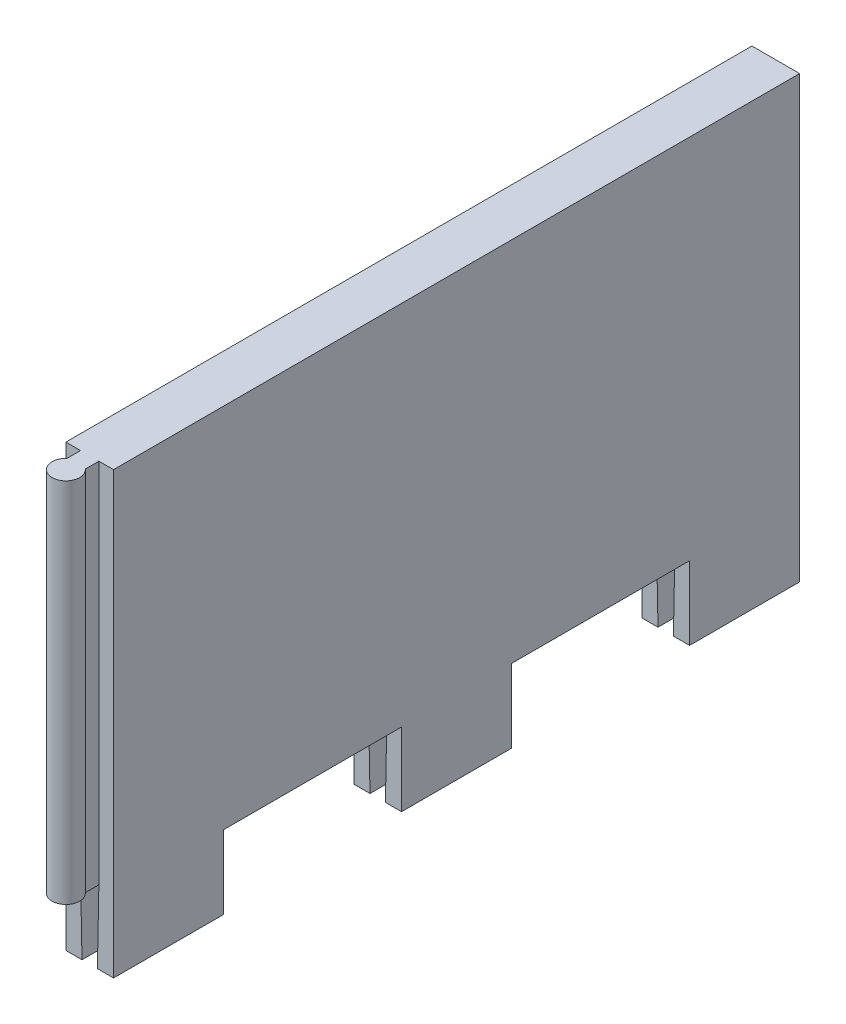
ISO-10303-21;
HEADER;
FILE_DESCRIPTION(('STEP AP214'),'2;1');
FILE_NAME('part.step','',(''),(''),'','','');
FILE_SCHEMA(('AUTOMOTIVE_DESIGN { 1 0 10303 214 1 1 1 1 }'));
ENDSEC;
DATA;
#1=APPLICATION_CONTEXT('core data for automotive mechanical design processes');
#2=APPLICATION_PROTOCOL_DEFINITION('international standard','automotive_design',2000,#1);
#3=PRODUCT_CONTEXT('',#1,'mechanical');
#4=PRODUCT('Part','Part','',(#3));
#5=PRODUCT_RELATED_PRODUCT_CATEGORY('part','',(#4));
#6=PRODUCT_DEFINITION_FORMATION('','',#4);
#7=PRODUCT_DEFINITION_CONTEXT('part definition',#1,'design');
#8=PRODUCT_DEFINITION('design','',#6,#7);
#9=PRODUCT_DEFINITION_SHAPE('','',#8);
#10=(LENGTH_UNIT() NAMED_UNIT(*) SI_UNIT(.MILLI.,.METRE.));
#11=(NAMED_UNIT(*) PLANE_ANGLE_UNIT() SI_UNIT($,.RADIAN.));
#12=(NAMED_UNIT(*) SI_UNIT($,.STERADIAN.) SOLID_ANGLE_UNIT());
#13=UNCERTAINTY_MEASURE_WITH_UNIT(LENGTH_MEASURE(1.E-05),#10,'distance_accuracy_value','');
#14=(GEOMETRIC_REPRESENTATION_CONTEXT(3) GLOBAL_UNCERTAINTY_ASSIGNED_CONTEXT((#13)) GLOBAL_UNIT_ASSIGNED_CONTEXT((#10,
#11,#12)) REPRESENTATION_CONTEXT('',''));
#15=CARTESIAN_POINT('',(0.,0.,0.));
#16=DIRECTION('',(0.,0.,1.));
#17=DIRECTION('',(1.,0.,0.));
#18=AXIS2_PLACEMENT_3D('',#15,#16,#17);
#19=CARTESIAN_POINT('',(0.,0.,0.));
#20=DIRECTION('',(0.,1.,0.));
#21=DIRECTION('',(0.,0.,1.));
#22=AXIS2_PLACEMENT_3D('',#19,#20,#21);
#23=PLANE('',#22);
#24=DIRECTION('',(0.,0.,1.));
#25=VECTOR('',#24,1.);
#26=CARTESIAN_POINT('',(-60.96,0.,0.));
#27=LINE('',#26,#25);
#28=CARTESIAN_POINT('',(-60.96,0.,-27.305));
#29=VERTEX_POINT('',#28);
#30=CARTESIAN_POINT('',(-60.96,0.,-8.255));
#31=VERTEX_POINT('',#30);
#32=EDGE_CURVE('E375',#29,#31,#27,.T.);
#33=ORIENTED_EDGE('',*,*,#32,.T.);
#34=DIRECTION('',(1.,0.,0.));
#35=VECTOR('',#34,1.);
#36=CARTESIAN_POINT('',(0.,0.,-8.25500000000002));
#37=LINE('',#36,#35);
#38=CARTESIAN_POINT('',(-63.7539999999999,0.,-8.25500000000002));
#39=VERTEX_POINT('',#38);
#40=EDGE_CURVE('E243',#39,#31,#37,.T.);
#41=ORIENTED_EDGE('',*,*,#40,.F.);
#42=DIRECTION('',(0.,0.,-1.));
#43=VECTOR('',#42,1.);
#44=CARTESIAN_POINT('',(-63.754,0.,4.83339596742091));
#45=LINE('',#44,#43);
#46=CARTESIAN_POINT('',(-63.7539999999998,0.,-27.305));
#47=VERTEX_POINT('',#46);
#48=EDGE_CURVE('E365',#39,#47,#45,.T.);
#49=ORIENTED_EDGE('',*,*,#48,.T.);
#50=DIRECTION('',(-1.,0.,0.));
#51=VECTOR('',#50,1.);
#52=CARTESIAN_POINT('',(0.,0.,-27.3050000000001));
#53=LINE('',#52,#51);
#54=EDGE_CURVE('E306',#29,#47,#53,.T.);
#55=ORIENTED_EDGE('',*,*,#54,.F.);
#56=EDGE_LOOP('',(#33,#41,#49,#55));
#57=FACE_BOUND('',#56,.T.);
#58=ADVANCED_FACE('F40',(#57),#23,.F.);
#59=CARTESIAN_POINT('',(0.,76.2,0.));
#60=DIRECTION('',(0.,1.,0.));
#61=DIRECTION('',(0.,0.,1.));
#62=AXIS2_PLACEMENT_3D('',#59,#60,#61);
#63=PLANE('',#62);
#64=DIRECTION('',(0.,0.,1.));
#65=VECTOR('',#64,1.);
#66=CARTESIAN_POINT('',(-63.5,76.2,0.));
#67=LINE('',#66,#65);
#68=CARTESIAN_POINT('',(-63.5,76.2,-8.255));
#69=VERTEX_POINT('',#68);
#70=CARTESIAN_POINT('',(-63.5,76.2,-5.90237895714043));
#71=VERTEX_POINT('',#70);
#72=EDGE_CURVE('E237',#69,#71,#67,.T.);
#73=ORIENTED_EDGE('',*,*,#72,.F.);
#74=DIRECTION('',(-1.,0.,0.));
#75=VECTOR('',#74,1.);
#76=CARTESIAN_POINT('',(0.,76.2,-8.25500000000001));
#77=LINE('',#76,#75);
#78=CARTESIAN_POINT('',(-60.96,76.2,-8.255));
#79=VERTEX_POINT('',#78);
#80=EDGE_CURVE('E225',#79,#69,#77,.T.);
#81=ORIENTED_EDGE('',*,*,#80,.F.);
#82=DIRECTION('',(0.,0.,1.));
#83=VECTOR('',#82,1.);
#84=CARTESIAN_POINT('',(-60.96,76.2,0.));
#85=LINE('',#84,#83);
#86=CARTESIAN_POINT('',(-60.96,76.2,-127.));
#87=VERTEX_POINT('',#86);
#88=EDGE_CURVE('E377',#87,#79,#85,.T.);
#89=ORIENTED_EDGE('',*,*,#88,.F.);
#90=DIRECTION('',(1.,0.,0.));
#91=VECTOR('',#90,1.);
#92=CARTESIAN_POINT('',(-4.27008855625061E-13,76.2,-127.));
#93=LINE('',#92,#91);
#94=CARTESIAN_POINT('',(-69.215,76.2,-127.));
#95=VERTEX_POINT('',#94);
#96=EDGE_CURVE('E379',#95,#87,#93,.T.);
#97=ORIENTED_EDGE('',*,*,#96,.F.);
#98=DIRECTION('',(0.,0.,1.));
#99=VECTOR('',#98,1.);
#100=CARTESIAN_POINT('',(-69.215,76.2,0.));
#101=LINE('',#100,#99);
#102=CARTESIAN_POINT('',(-69.215,76.2,-8.255));
#103=VERTEX_POINT('',#102);
#104=EDGE_CURVE('E383',#95,#103,#101,.T.);
#105=ORIENTED_EDGE('',*,*,#104,.T.);
#106=DIRECTION('',(1.,0.,0.));
#107=VECTOR('',#106,1.);
#108=CARTESIAN_POINT('',(0.,76.2,-8.25500000000001));
#109=LINE('',#108,#107);
#110=CARTESIAN_POINT('',(-66.675,76.2,-8.255));
#111=VERTEX_POINT('',#110);
#112=EDGE_CURVE('E256',#103,#111,#109,.T.);
#113=ORIENTED_EDGE('',*,*,#112,.T.);
#114=DIRECTION('',(0.,0.,1.));
#115=VECTOR('',#114,1.);
#116=CARTESIAN_POINT('',(-66.675,76.2,0.));
#117=LINE('',#116,#115);
#118=CARTESIAN_POINT('',(-66.675,76.2,-5.90237895714047));
#119=VERTEX_POINT('',#118);
#120=EDGE_CURVE('E252',#111,#119,#117,.T.);
#121=ORIENTED_EDGE('',*,*,#120,.T.);
#122=CARTESIAN_POINT('',(-65.0875,76.2,-4.1275));
#123=DIRECTION('',(0.,1.,0.));
#124=DIRECTION('',(0.,0.,1.));
#125=AXIS2_PLACEMENT_3D('',#122,#123,#124);
#126=CIRCLE('',#125,2.38125000000001);
#127=EDGE_CURVE('E250',#119,#71,#126,.T.);
#128=ORIENTED_EDGE('',*,*,#127,.T.);
#129=EDGE_LOOP('',(#73,#81,#89,#97,#105,#113,#121,#128));
#130=FACE_BOUND('',#129,.T.);
#131=ADVANCED_FACE('F247',(#130),#63,.T.);
#132=CARTESIAN_POINT('',(0.,12.7,0.));
#133=DIRECTION('',(0.,-1.,0.));
#134=DIRECTION('',(0.,0.,-1.));
#135=AXIS2_PLACEMENT_3D('',#132,#133,#134);
#136=PLANE('',#135);
#137=DIRECTION('',(1.,0.,0.));
#138=VECTOR('',#137,1.);
#139=CARTESIAN_POINT('',(0.,12.7,-8.25500000000002));
#140=LINE('',#139,#138);
#141=CARTESIAN_POINT('',(-66.675,12.7,-8.255));
#142=VERTEX_POINT('',#141);
#143=CARTESIAN_POINT('',(-63.5,12.7,-8.255));
#144=VERTEX_POINT('',#143);
#145=EDGE_CURVE('E321',#142,#144,#140,.T.);
#146=ORIENTED_EDGE('',*,*,#145,.T.);
#147=DIRECTION('',(0.,0.,1.));
#148=VECTOR('',#147,1.);
#149=CARTESIAN_POINT('',(-63.5,12.7,0.));
#150=LINE('',#149,#148);
#151=CARTESIAN_POINT('',(-63.5,12.7,-5.90237895714043));
#152=VERTEX_POINT('',#151);
#153=EDGE_CURVE('E11',#144,#152,#150,.T.);
#154=ORIENTED_EDGE('',*,*,#153,.T.);
#155=CARTESIAN_POINT('',(-65.0875,12.7,-4.1275));
#156=DIRECTION('',(0.,-1.,0.));
#157=DIRECTION('',(0.,0.,-1.));
#158=AXIS2_PLACEMENT_3D('',#155,#156,#157);
#159=CIRCLE('',#158,2.38125000000001);
#160=CARTESIAN_POINT('',(-66.675,12.7,-5.90237895714047));
#161=VERTEX_POINT('',#160);
#162=EDGE_CURVE('E48',#161,#152,#159,.F.);
#163=ORIENTED_EDGE('',*,*,#162,.F.);
#164=DIRECTION('',(0.,0.,1.));
#165=VECTOR('',#164,1.);
#166=CARTESIAN_POINT('',(-66.675,12.7,0.));
#167=LINE('',#166,#165);
#168=EDGE_CURVE('E414',#142,#161,#167,.T.);
#169=ORIENTED_EDGE('',*,*,#168,.F.);
#170=EDGE_LOOP('',(#146,#154,#163,#169));
#171=FACE_BOUND('',#170,.T.);
#172=ADVANCED_FACE('F420',(#171),#136,.T.);
#173=DIRECTION('',(0.,0.,-1.));
#174=VECTOR('',#173,1.);
#175=CARTESIAN_POINT('',(-66.421,0.,4.83339596742091));
#176=LINE('',#175,#174);
#177=CARTESIAN_POINT('',(-66.4209999999999,0.,-8.25500000000002));
#178=VERTEX_POINT('',#177);
#179=CARTESIAN_POINT('',(-66.4209999999998,0.,-27.305));
#180=VERTEX_POINT('',#179);
#181=EDGE_CURVE('E356',#178,#180,#176,.T.);
#182=ORIENTED_EDGE('',*,*,#181,.F.);
#183=CARTESIAN_POINT('',(-69.215,0.,-8.25500000000002));
#184=VERTEX_POINT('',#183);
#185=EDGE_CURVE('E323',#184,#178,#37,.T.);
#186=ORIENTED_EDGE('',*,*,#185,.F.);
#187=DIRECTION('',(0.,0.,1.));
#188=VECTOR('',#187,1.);
#189=CARTESIAN_POINT('',(-69.215,0.,0.));
#190=LINE('',#189,#188);
#191=CARTESIAN_POINT('',(-69.215,0.,-27.305));
#192=VERTEX_POINT('',#191);
#193=EDGE_CURVE('E395',#192,#184,#190,.T.);
#194=ORIENTED_EDGE('',*,*,#193,.F.);
#195=EDGE_CURVE('E309',#180,#192,#53,.T.);
#196=ORIENTED_EDGE('',*,*,#195,.F.);
#197=EDGE_LOOP('',(#182,#186,#194,#196));
#198=FACE_BOUND('',#197,.T.);
#199=ADVANCED_FACE('F436',(#198),#23,.F.);
#200=DIRECTION('',(-1.,0.,0.));
#201=VECTOR('',#200,1.);
#202=CARTESIAN_POINT('',(0.,0.,-58.1025));
#203=LINE('',#202,#201);
#204=CARTESIAN_POINT('',(-66.4209999999998,0.,-58.1025));
#205=VERTEX_POINT('',#204);
#206=CARTESIAN_POINT('',(-69.215,0.,-58.1025));
#207=VERTEX_POINT('',#206);
#208=EDGE_CURVE('E308',#205,#207,#203,.T.);
#209=ORIENTED_EDGE('',*,*,#208,.T.);
#210=CARTESIAN_POINT('',(-69.215,0.,-77.1525));
#211=VERTEX_POINT('',#210);
#212=EDGE_CURVE('E398',#211,#207,#190,.T.);
#213=ORIENTED_EDGE('',*,*,#212,.F.);
#214=DIRECTION('',(-1.,0.,0.));
#215=VECTOR('',#214,1.);
#216=CARTESIAN_POINT('',(0.,0.,-77.1525));
#217=LINE('',#216,#215);
#218=CARTESIAN_POINT('',(-66.4209999999997,0.,-77.1525));
#219=VERTEX_POINT('',#218);
#220=EDGE_CURVE('E281',#219,#211,#217,.T.);
#221=ORIENTED_EDGE('',*,*,#220,.F.);
#222=EDGE_CURVE('E363',#205,#219,#176,.T.);
#223=ORIENTED_EDGE('',*,*,#222,.F.);
#224=EDGE_LOOP('',(#209,#213,#221,#223));
#225=FACE_BOUND('',#224,.T.);
#226=ADVANCED_FACE('F496',(#225),#23,.F.);
#227=CARTESIAN_POINT('',(-60.96,0.,-58.1025));
#228=VERTEX_POINT('',#227);
#229=CARTESIAN_POINT('',(-63.7539999999998,0.,-58.1025));
#230=VERTEX_POINT('',#229);
#231=EDGE_CURVE('E297',#228,#230,#203,.T.);
#232=ORIENTED_EDGE('',*,*,#231,.T.);
#233=CARTESIAN_POINT('',(-63.7539999999996,0.,-77.1525));
#234=VERTEX_POINT('',#233);
#235=EDGE_CURVE('E368',#230,#234,#45,.T.);
#236=ORIENTED_EDGE('',*,*,#235,.T.);
#237=CARTESIAN_POINT('',(-60.96,0.,-77.1525));
#238=VERTEX_POINT('',#237);
#239=EDGE_CURVE('E268',#238,#234,#217,.T.);
#240=ORIENTED_EDGE('',*,*,#239,.F.);
#241=EDGE_CURVE('E391',#238,#228,#27,.T.);
#242=ORIENTED_EDGE('',*,*,#241,.T.);
#243=EDGE_LOOP('',(#232,#236,#240,#242));
#244=FACE_BOUND('',#243,.T.);
#245=ADVANCED_FACE('F510',(#244),#23,.F.);
#246=DIRECTION('',(-1.,0.,0.));
#247=VECTOR('',#246,1.);
#248=CARTESIAN_POINT('',(0.,0.,-107.95));
#249=LINE('',#248,#247);
#250=CARTESIAN_POINT('',(-66.4209999999997,0.,-107.95));
#251=VERTEX_POINT('',#250);
#252=CARTESIAN_POINT('',(-69.215,0.,-107.95));
#253=VERTEX_POINT('',#252);
#254=EDGE_CURVE('E282',#251,#253,#249,.T.);
#255=ORIENTED_EDGE('',*,*,#254,.T.);
#256=CARTESIAN_POINT('',(-69.215,0.,-127.));
#257=VERTEX_POINT('',#256);
#258=EDGE_CURVE('E380',#257,#253,#190,.T.);
#259=ORIENTED_EDGE('',*,*,#258,.F.);
#260=DIRECTION('',(1.,0.,0.));
#261=VECTOR('',#260,1.);
#262=CARTESIAN_POINT('',(-4.27008855625061E-13,0.,-127.));
#263=LINE('',#262,#261);
#264=CARTESIAN_POINT('',(-66.4209999999996,0.,-127.));
#265=VERTEX_POINT('',#264);
#266=EDGE_CURVE('E392',#257,#265,#263,.T.);
#267=ORIENTED_EDGE('',*,*,#266,.T.);
#268=EDGE_CURVE('E364',#251,#265,#176,.T.);
#269=ORIENTED_EDGE('',*,*,#268,.F.);
#270=EDGE_LOOP('',(#255,#259,#267,#269));
#271=FACE_BOUND('',#270,.T.);
#272=ADVANCED_FACE('F468',(#271),#23,.F.);
#273=CARTESIAN_POINT('',(-60.96,0.,-107.95));
#274=VERTEX_POINT('',#273);
#275=CARTESIAN_POINT('',(-63.7539999999996,0.,-107.95));
#276=VERTEX_POINT('',#275);
#277=EDGE_CURVE('E278',#274,#276,#249,.T.);
#278=ORIENTED_EDGE('',*,*,#277,.T.);
#279=CARTESIAN_POINT('',(-63.7539999999995,0.,-127.));
#280=VERTEX_POINT('',#279);
#281=EDGE_CURVE('E359',#276,#280,#45,.T.);
#282=ORIENTED_EDGE('',*,*,#281,.T.);
#283=CARTESIAN_POINT('',(-60.96,0.,-127.));
#284=VERTEX_POINT('',#283);
#285=EDGE_CURVE('E390',#280,#284,#263,.T.);
#286=ORIENTED_EDGE('',*,*,#285,.T.);
#287=EDGE_CURVE('E387',#284,#274,#27,.T.);
#288=ORIENTED_EDGE('',*,*,#287,.T.);
#289=EDGE_LOOP('',(#278,#282,#286,#288));
#290=FACE_BOUND('',#289,.T.);
#291=ADVANCED_FACE('F516',(#290),#23,.F.);
#292=CARTESIAN_POINT('',(-60.96,76.2,0.));
#293=DIRECTION('',(1.,0.,0.));
#294=DIRECTION('',(0.,0.,-1.));
#295=AXIS2_PLACEMENT_3D('',#292,#293,#294);
#296=PLANE('',#295);
#297=DIRECTION('',(0.,0.,1.));
#298=VECTOR('',#297,1.);
#299=CARTESIAN_POINT('',(-60.96,12.7,0.));
#300=LINE('',#299,#298);
#301=CARTESIAN_POINT('',(-60.96,12.7,-58.1025));
#302=VERTEX_POINT('',#301);
#303=CARTESIAN_POINT('',(-60.96,12.7,-27.305));
#304=VERTEX_POINT('',#303);
#305=EDGE_CURVE('E293',#302,#304,#300,.T.);
#306=ORIENTED_EDGE('',*,*,#305,.F.);
#307=DIRECTION('',(0.,-1.,0.));
#308=VECTOR('',#307,1.);
#309=CARTESIAN_POINT('',(-60.96,12.7,-58.1025));
#310=LINE('',#309,#308);
#311=EDGE_CURVE('E312',#302,#228,#310,.T.);
#312=ORIENTED_EDGE('',*,*,#311,.T.);
#313=ORIENTED_EDGE('',*,*,#241,.F.);
#314=DIRECTION('',(0.,-1.,0.));
#315=VECTOR('',#314,1.);
#316=CARTESIAN_POINT('',(-60.96,12.7,-77.1525));
#317=LINE('',#316,#315);
#318=CARTESIAN_POINT('',(-60.96,12.7,-77.1525));
#319=VERTEX_POINT('',#318);
#320=EDGE_CURVE('E289',#319,#238,#317,.T.);
#321=ORIENTED_EDGE('',*,*,#320,.F.);
#322=DIRECTION('',(0.,0.,1.));
#323=VECTOR('',#322,1.);
#324=CARTESIAN_POINT('',(-60.96,12.7,0.));
#325=LINE('',#324,#323);
#326=CARTESIAN_POINT('',(-60.96,12.7,-107.95));
#327=VERTEX_POINT('',#326);
#328=EDGE_CURVE('E267',#327,#319,#325,.T.);
#329=ORIENTED_EDGE('',*,*,#328,.F.);
#330=DIRECTION('',(0.,-1.,0.));
#331=VECTOR('',#330,1.);
#332=CARTESIAN_POINT('',(-60.96,12.7,-107.95));
#333=LINE('',#332,#331);
#334=EDGE_CURVE('E277',#327,#274,#333,.T.);
#335=ORIENTED_EDGE('',*,*,#334,.T.);
#336=ORIENTED_EDGE('',*,*,#287,.F.);
#337=DIRECTION('',(0.,-1.,0.));
#338=VECTOR('',#337,1.);
#339=CARTESIAN_POINT('',(-60.96,76.2,-127.));
#340=LINE('',#339,#338);
#341=EDGE_CURVE('E402',#87,#284,#340,.T.);
#342=ORIENTED_EDGE('',*,*,#341,.F.);
#343=ORIENTED_EDGE('',*,*,#88,.T.);
#344=DIRECTION('',(0.,-1.,0.));
#345=VECTOR('',#344,1.);
#346=CARTESIAN_POINT('',(-60.96,76.2,-8.255));
#347=LINE('',#346,#345);
#348=EDGE_CURVE('E232',#79,#31,#347,.T.);
#349=ORIENTED_EDGE('',*,*,#348,.T.);
#350=ORIENTED_EDGE('',*,*,#32,.F.);
#351=DIRECTION('',(0.,-1.,0.));
#352=VECTOR('',#351,1.);
#353=CARTESIAN_POINT('',(-60.96,12.7,-27.305));
#354=LINE('',#353,#352);
#355=EDGE_CURVE('E305',#304,#29,#354,.T.);
#356=ORIENTED_EDGE('',*,*,#355,.F.);
#357=EDGE_LOOP('',(#306,#312,#313,#321,#329,#335,#336,#342,#343,#349,#350,#356));
#358=FACE_BOUND('',#357,.T.);
#359=ADVANCED_FACE('F42',(#358),#296,.T.);
#360=CARTESIAN_POINT('',(-69.215,76.2,0.));
#361=DIRECTION('',(1.,0.,0.));
#362=DIRECTION('',(0.,0.,-1.));
#363=AXIS2_PLACEMENT_3D('',#360,#361,#362);
#364=PLANE('',#363);
#365=DIRECTION('',(0.,-1.,0.));
#366=VECTOR('',#365,1.);
#367=CARTESIAN_POINT('',(-69.215,12.7,-58.1025));
#368=LINE('',#367,#366);
#369=CARTESIAN_POINT('',(-69.215,12.7,-58.1025));
#370=VERTEX_POINT('',#369);
#371=EDGE_CURVE('E315',#370,#207,#368,.T.);
#372=ORIENTED_EDGE('',*,*,#371,.F.);
#373=DIRECTION('',(0.,0.,-1.));
#374=VECTOR('',#373,1.);
#375=CARTESIAN_POINT('',(-69.215,12.7,0.));
#376=LINE('',#375,#374);
#377=CARTESIAN_POINT('',(-69.215,12.7,-27.305));
#378=VERTEX_POINT('',#377);
#379=EDGE_CURVE('E300',#378,#370,#376,.T.);
#380=ORIENTED_EDGE('',*,*,#379,.F.);
#381=DIRECTION('',(0.,-1.,0.));
#382=VECTOR('',#381,1.);
#383=CARTESIAN_POINT('',(-69.215,12.7,-27.305));
#384=LINE('',#383,#382);
#385=EDGE_CURVE('E317',#378,#192,#384,.T.);
#386=ORIENTED_EDGE('',*,*,#385,.T.);
#387=ORIENTED_EDGE('',*,*,#193,.T.);
#388=DIRECTION('',(0.,-1.,0.));
#389=VECTOR('',#388,1.);
#390=CARTESIAN_POINT('',(-69.215,76.2,-8.255));
#391=LINE('',#390,#389);
#392=EDGE_CURVE('E386',#103,#184,#391,.T.);
#393=ORIENTED_EDGE('',*,*,#392,.F.);
#394=ORIENTED_EDGE('',*,*,#104,.F.);
#395=DIRECTION('',(0.,-1.,0.));
#396=VECTOR('',#395,1.);
#397=CARTESIAN_POINT('',(-69.215,76.2,-127.));
#398=LINE('',#397,#396);
#399=EDGE_CURVE('E400',#95,#257,#398,.T.);
#400=ORIENTED_EDGE('',*,*,#399,.T.);
#401=ORIENTED_EDGE('',*,*,#258,.T.);
#402=DIRECTION('',(0.,-1.,0.));
#403=VECTOR('',#402,1.);
#404=CARTESIAN_POINT('',(-69.215,12.7,-107.95));
#405=LINE('',#404,#403);
#406=CARTESIAN_POINT('',(-69.215,12.7,-107.95));
#407=VERTEX_POINT('',#406);
#408=EDGE_CURVE('E284',#407,#253,#405,.T.);
#409=ORIENTED_EDGE('',*,*,#408,.F.);
#410=DIRECTION('',(0.,0.,-1.));
#411=VECTOR('',#410,1.);
#412=CARTESIAN_POINT('',(-69.215,12.7,0.));
#413=LINE('',#412,#411);
#414=CARTESIAN_POINT('',(-69.215,12.7,-77.1525));
#415=VERTEX_POINT('',#414);
#416=EDGE_CURVE('E274',#415,#407,#413,.T.);
#417=ORIENTED_EDGE('',*,*,#416,.F.);
#418=DIRECTION('',(0.,-1.,0.));
#419=VECTOR('',#418,1.);
#420=CARTESIAN_POINT('',(-69.215,12.7,-77.1525));
#421=LINE('',#420,#419);
#422=EDGE_CURVE('E286',#415,#211,#421,.T.);
#423=ORIENTED_EDGE('',*,*,#422,.T.);
#424=ORIENTED_EDGE('',*,*,#212,.T.);
#425=EDGE_LOOP('',(#372,#380,#386,#387,#393,#394,#400,#401,#409,#417,#423,#424));
#426=FACE_BOUND('',#425,.T.);
#427=ADVANCED_FACE('F430',(#426),#364,.F.);
#428=CARTESIAN_POINT('',(0.,12.6974597459492,4.83339596742113));
#429=DIRECTION('',(0.,1.,0.));
#430=DIRECTION('',(0.,0.,1.));
#431=AXIS2_PLACEMENT_3D('',#428,#429,#430);
#432=PLANE('',#431);
#433=DIRECTION('',(1.,0.,0.));
#434=VECTOR('',#433,1.);
#435=CARTESIAN_POINT('',(0.,12.6974597459492,-58.1025));
#436=LINE('',#435,#434);
#437=CARTESIAN_POINT('',(-66.6749999999998,12.6974597459492,-58.1025));
#438=VERTEX_POINT('',#437);
#439=CARTESIAN_POINT('',(-63.4999999999995,12.6974597459492,-58.1025));
#440=VERTEX_POINT('',#439);
#441=EDGE_CURVE('E337',#438,#440,#436,.T.);
#442=ORIENTED_EDGE('',*,*,#441,.F.);
#443=DIRECTION('',(0.,0.,-1.));
#444=VECTOR('',#443,1.);
#445=CARTESIAN_POINT('',(-66.675,12.6974597459492,4.83339596742091));
#446=LINE('',#445,#444);
#447=CARTESIAN_POINT('',(-66.6749999999997,12.6974597459492,-77.1525));
#448=VERTEX_POINT('',#447);
#449=EDGE_CURVE('E376',#438,#448,#446,.T.);
#450=ORIENTED_EDGE('',*,*,#449,.T.);
#451=DIRECTION('',(1.,0.,0.));
#452=VECTOR('',#451,1.);
#453=CARTESIAN_POINT('',(0.,12.6974597459492,-77.1525));
#454=LINE('',#453,#452);
#455=CARTESIAN_POINT('',(-63.4999999999995,12.6974597459492,-77.1525));
#456=VERTEX_POINT('',#455);
#457=EDGE_CURVE('E55',#448,#456,#454,.T.);
#458=ORIENTED_EDGE('',*,*,#457,.T.);
#459=DIRECTION('',(0.,0.,-1.));
#460=VECTOR('',#459,1.);
#461=CARTESIAN_POINT('',(-63.5,12.6974597459492,4.83339596742091));
#462=LINE('',#461,#460);
#463=EDGE_CURVE('E371',#440,#456,#462,.T.);
#464=ORIENTED_EDGE('',*,*,#463,.F.);
#465=EDGE_LOOP('',(#442,#450,#458,#464));
#466=FACE_BOUND('',#465,.T.);
#467=ADVANCED_FACE('F483',(#466),#432,.F.);
#468=DIRECTION('',(1.,0.,0.));
#469=VECTOR('',#468,1.);
#470=CARTESIAN_POINT('',(0.,12.6974597459492,-107.95));
#471=LINE('',#470,#469);
#472=CARTESIAN_POINT('',(-66.6749999999996,12.6974597459492,-107.95));
#473=VERTEX_POINT('',#472);
#474=CARTESIAN_POINT('',(-63.4999999999995,12.6974597459492,-107.95));
#475=VERTEX_POINT('',#474);
#476=EDGE_CURVE('E329',#473,#475,#471,.T.);
#477=ORIENTED_EDGE('',*,*,#476,.F.);
#478=CARTESIAN_POINT('',(-66.6749999999995,12.6974597459492,-127.));
#479=VERTEX_POINT('',#478);
#480=EDGE_CURVE('E355',#473,#479,#446,.T.);
#481=ORIENTED_EDGE('',*,*,#480,.T.);
#482=DIRECTION('',(1.,0.,0.));
#483=VECTOR('',#482,1.);
#484=CARTESIAN_POINT('',(4.27376104273545E-13,12.6974597459492,-127.));
#485=LINE('',#484,#483);
#486=CARTESIAN_POINT('',(-63.4999999999995,12.6974597459492,-127.));
#487=VERTEX_POINT('',#486);
#488=EDGE_CURVE('E346',#479,#487,#485,.T.);
#489=ORIENTED_EDGE('',*,*,#488,.T.);
#490=EDGE_CURVE('E352',#475,#487,#462,.T.);
#491=ORIENTED_EDGE('',*,*,#490,.F.);
#492=EDGE_LOOP('',(#477,#481,#489,#491));
#493=FACE_BOUND('',#492,.T.);
#494=ADVANCED_FACE('F521',(#493),#432,.F.);
#495=CARTESIAN_POINT('',(-63.7284984,1.27482495849325,4.83339596742091));
#496=DIRECTION('',(0.999799979995999,-0.0199999999999992,0.));
#497=DIRECTION('',(0.0199999999999992,0.999799979995999,0.));
#498=AXIS2_PLACEMENT_3D('',#495,#496,#497);
#499=PLANE('',#498);
#500=DIRECTION('',(-0.0199999999999992,-0.999799979995999,0.));
#501=VECTOR('',#500,1.);
#502=CARTESIAN_POINT('',(-63.7284983999998,1.27482495849324,-58.1025));
#503=LINE('',#502,#501);
#504=EDGE_CURVE('E339',#440,#230,#503,.T.);
#505=ORIENTED_EDGE('',*,*,#504,.F.);
#506=ORIENTED_EDGE('',*,*,#463,.T.);
#507=DIRECTION('',(-0.0199999999999992,-0.999799979995999,0.));
#508=VECTOR('',#507,1.);
#509=CARTESIAN_POINT('',(-63.7284983999997,1.27482495849324,-77.1525));
#510=LINE('',#509,#508);
#511=EDGE_CURVE('E326',#456,#234,#510,.T.);
#512=ORIENTED_EDGE('',*,*,#511,.T.);
#513=ORIENTED_EDGE('',*,*,#235,.F.);
#514=EDGE_LOOP('',(#505,#506,#512,#513));
#515=FACE_BOUND('',#514,.T.);
#516=ADVANCED_FACE('F522',(#515),#499,.F.);
#517=DIRECTION('',(-0.0199999999999992,-0.999799979995999,0.));
#518=VECTOR('',#517,1.);
#519=CARTESIAN_POINT('',(-63.7284983999996,1.27482495849324,-107.95));
#520=LINE('',#519,#518);
#521=EDGE_CURVE('E331',#475,#276,#520,.T.);
#522=ORIENTED_EDGE('',*,*,#521,.F.);
#523=ORIENTED_EDGE('',*,*,#490,.T.);
#524=DIRECTION('',(-0.0199999999999992,-0.999799979995999,0.));
#525=VECTOR('',#524,1.);
#526=CARTESIAN_POINT('',(-63.7284983999995,1.27482495849325,-127.));
#527=LINE('',#526,#525);
#528=EDGE_CURVE('E342',#487,#280,#527,.T.);
#529=ORIENTED_EDGE('',*,*,#528,.T.);
#530=ORIENTED_EDGE('',*,*,#281,.F.);
#531=EDGE_LOOP('',(#522,#523,#529,#530));
#532=FACE_BOUND('',#531,.T.);
#533=ADVANCED_FACE('F519',(#532),#499,.F.);
#534=CARTESIAN_POINT('',(-66.3944316,-1.32815428942623,4.83339596742091));
#535=DIRECTION('',(-0.999799979995999,-0.0199999999999992,0.));
#536=DIRECTION('',(0.0199999999999992,-0.999799979995999,0.));
#537=AXIS2_PLACEMENT_3D('',#534,#535,#536);
#538=PLANE('',#537);
#539=DIRECTION('',(-0.0199999999999992,0.999799979995999,0.));
#540=VECTOR('',#539,1.);
#541=CARTESIAN_POINT('',(-66.3944315999998,-1.32815428942623,-58.1025));
#542=LINE('',#541,#540);
#543=EDGE_CURVE('E412',#205,#438,#542,.T.);
#544=ORIENTED_EDGE('',*,*,#543,.F.);
#545=ORIENTED_EDGE('',*,*,#222,.T.);
#546=DIRECTION('',(-0.0199999999999992,0.999799979995999,0.));
#547=VECTOR('',#546,1.);
#548=CARTESIAN_POINT('',(-66.3944315999997,-1.32815428942623,-77.1525));
#549=LINE('',#548,#547);
#550=EDGE_CURVE('E406',#219,#448,#549,.T.);
#551=ORIENTED_EDGE('',*,*,#550,.T.);
#552=ORIENTED_EDGE('',*,*,#449,.F.);
#553=EDGE_LOOP('',(#544,#545,#551,#552));
#554=FACE_BOUND('',#553,.T.);
#555=ADVANCED_FACE('F488',(#554),#538,.F.);
#556=DIRECTION('',(-0.0199999999999992,0.999799979995999,0.));
#557=VECTOR('',#556,1.);
#558=CARTESIAN_POINT('',(-66.3944315999996,-1.32815428942623,-107.95));
#559=LINE('',#558,#557);
#560=EDGE_CURVE('E408',#251,#473,#559,.T.);
#561=ORIENTED_EDGE('',*,*,#560,.F.);
#562=ORIENTED_EDGE('',*,*,#268,.T.);
#563=DIRECTION('',(-0.0199999999999992,0.999799979995999,0.));
#564=VECTOR('',#563,1.);
#565=CARTESIAN_POINT('',(-66.3944315999995,-1.32815428942623,-127.));
#566=LINE('',#565,#564);
#567=EDGE_CURVE('E341',#265,#479,#566,.T.);
#568=ORIENTED_EDGE('',*,*,#567,.T.);
#569=ORIENTED_EDGE('',*,*,#480,.F.);
#570=EDGE_LOOP('',(#561,#562,#568,#569));
#571=FACE_BOUND('',#570,.T.);
#572=ADVANCED_FACE('F476',(#571),#538,.F.);
#573=CARTESIAN_POINT('',(-4.27008855625061E-13,76.2,-127.));
#574=DIRECTION('',(0.,0.,-1.));
#575=DIRECTION('',(-1.,0.,0.));
#576=AXIS2_PLACEMENT_3D('',#573,#574,#575);
#577=PLANE('',#576);
#578=ORIENTED_EDGE('',*,*,#528,.F.);
#579=ORIENTED_EDGE('',*,*,#488,.F.);
#580=ORIENTED_EDGE('',*,*,#567,.F.);
#581=ORIENTED_EDGE('',*,*,#266,.F.);
#582=ORIENTED_EDGE('',*,*,#399,.F.);
#583=ORIENTED_EDGE('',*,*,#96,.T.);
#584=ORIENTED_EDGE('',*,*,#341,.T.);
#585=ORIENTED_EDGE('',*,*,#285,.F.);
#586=EDGE_LOOP('',(#578,#579,#580,#581,#582,#583,#584,#585));
#587=FACE_BOUND('',#586,.T.);
#588=ADVANCED_FACE('F460',(#587),#577,.T.);
#589=CARTESIAN_POINT('',(-66.6749999999999,12.6974597459492,-8.25500000000002));
#590=VERTEX_POINT('',#589);
#591=CARTESIAN_POINT('',(-66.6749999999999,12.6974597459492,-27.305));
#592=VERTEX_POINT('',#591);
#593=EDGE_CURVE('E372',#590,#592,#446,.T.);
#594=ORIENTED_EDGE('',*,*,#593,.T.);
#595=DIRECTION('',(1.,0.,0.));
#596=VECTOR('',#595,1.);
#597=CARTESIAN_POINT('',(0.,12.6974597459492,-27.3050000000001));
#598=LINE('',#597,#596);
#599=CARTESIAN_POINT('',(-63.4999999999995,12.6974597459492,-27.305));
#600=VERTEX_POINT('',#599);
#601=EDGE_CURVE('E63',#592,#600,#598,.T.);
#602=ORIENTED_EDGE('',*,*,#601,.T.);
#603=CARTESIAN_POINT('',(-63.4999999999995,12.6974597459492,-8.25500000000002));
#604=VERTEX_POINT('',#603);
#605=EDGE_CURVE('E360',#604,#600,#462,.T.);
#606=ORIENTED_EDGE('',*,*,#605,.F.);
#607=DIRECTION('',(1.,0.,0.));
#608=VECTOR('',#607,1.);
#609=CARTESIAN_POINT('',(0.,12.6974597459492,-8.25500000000001));
#610=LINE('',#609,#608);
#611=EDGE_CURVE('E345',#590,#604,#610,.T.);
#612=ORIENTED_EDGE('',*,*,#611,.F.);
#613=EDGE_LOOP('',(#594,#602,#606,#612));
#614=FACE_BOUND('',#613,.T.);
#615=ADVANCED_FACE('F445',(#614),#432,.F.);
#616=ORIENTED_EDGE('',*,*,#605,.T.);
#617=DIRECTION('',(-0.0199999999999992,-0.999799979995999,0.));
#618=VECTOR('',#617,1.);
#619=CARTESIAN_POINT('',(-63.7284983999999,1.27482495849325,-27.305));
#620=LINE('',#619,#618);
#621=EDGE_CURVE('E334',#600,#47,#620,.T.);
#622=ORIENTED_EDGE('',*,*,#621,.T.);
#623=ORIENTED_EDGE('',*,*,#48,.F.);
#624=DIRECTION('',(-0.0199999999999992,-0.999799979995999,0.));
#625=VECTOR('',#624,1.);
#626=CARTESIAN_POINT('',(-63.7284983999999,1.27482495849325,-8.255));
#627=LINE('',#626,#625);
#628=EDGE_CURVE('E357',#604,#39,#627,.T.);
#629=ORIENTED_EDGE('',*,*,#628,.F.);
#630=EDGE_LOOP('',(#616,#622,#623,#629));
#631=FACE_BOUND('',#630,.T.);
#632=ADVANCED_FACE('F447',(#631),#499,.F.);
#633=ORIENTED_EDGE('',*,*,#181,.T.);
#634=DIRECTION('',(-0.0199999999999992,0.999799979995999,0.));
#635=VECTOR('',#634,1.);
#636=CARTESIAN_POINT('',(-66.3944315999999,-1.32815428942623,-27.305));
#637=LINE('',#636,#635);
#638=EDGE_CURVE('E410',#180,#592,#637,.T.);
#639=ORIENTED_EDGE('',*,*,#638,.T.);
#640=ORIENTED_EDGE('',*,*,#593,.F.);
#641=DIRECTION('',(-0.0199999999999992,0.999799979995999,0.));
#642=VECTOR('',#641,1.);
#643=CARTESIAN_POINT('',(-66.3944316,-1.32815428942623,-8.255));
#644=LINE('',#643,#642);
#645=EDGE_CURVE('E353',#178,#590,#644,.T.);
#646=ORIENTED_EDGE('',*,*,#645,.F.);
#647=EDGE_LOOP('',(#633,#639,#640,#646));
#648=FACE_BOUND('',#647,.T.);
#649=ADVANCED_FACE('F439',(#648),#538,.F.);
#650=CARTESIAN_POINT('',(0.,12.7,-8.25500000000002));
#651=DIRECTION('',(0.,0.,-1.));
#652=DIRECTION('',(-1.,0.,0.));
#653=AXIS2_PLACEMENT_3D('',#650,#651,#652);
#654=PLANE('',#653);
#655=ORIENTED_EDGE('',*,*,#645,.T.);
#656=ORIENTED_EDGE('',*,*,#611,.T.);
#657=ORIENTED_EDGE('',*,*,#628,.T.);
#658=ORIENTED_EDGE('',*,*,#40,.T.);
#659=ORIENTED_EDGE('',*,*,#348,.F.);
#660=ORIENTED_EDGE('',*,*,#80,.T.);
#661=DIRECTION('',(0.,-1.,0.));
#662=VECTOR('',#661,1.);
#663=CARTESIAN_POINT('',(-63.5,76.2,-8.255));
#664=LINE('',#663,#662);
#665=EDGE_CURVE('E229',#69,#144,#664,.T.);
#666=ORIENTED_EDGE('',*,*,#665,.T.);
#667=ORIENTED_EDGE('',*,*,#145,.F.);
#668=DIRECTION('',(0.,-1.,0.));
#669=VECTOR('',#668,1.);
#670=CARTESIAN_POINT('',(-66.675,76.2,-8.255));
#671=LINE('',#670,#669);
#672=EDGE_CURVE('E259',#111,#142,#671,.T.);
#673=ORIENTED_EDGE('',*,*,#672,.F.);
#674=ORIENTED_EDGE('',*,*,#112,.F.);
#675=ORIENTED_EDGE('',*,*,#392,.T.);
#676=ORIENTED_EDGE('',*,*,#185,.T.);
#677=EDGE_LOOP('',(#655,#656,#657,#658,#659,#660,#666,#667,#673,#674,#675,#676));
#678=FACE_BOUND('',#677,.T.);
#679=ADVANCED_FACE('F227',(#678),#654,.F.);
#680=CARTESIAN_POINT('',(0.,12.7,-107.95));
#681=DIRECTION('',(0.,0.,1.));
#682=DIRECTION('',(1.,0.,0.));
#683=AXIS2_PLACEMENT_3D('',#680,#681,#682);
#684=PLANE('',#683);
#685=ORIENTED_EDGE('',*,*,#521,.T.);
#686=ORIENTED_EDGE('',*,*,#277,.F.);
#687=ORIENTED_EDGE('',*,*,#334,.F.);
#688=DIRECTION('',(-1.,0.,0.));
#689=VECTOR('',#688,1.);
#690=CARTESIAN_POINT('',(0.,12.7,-107.95));
#691=LINE('',#690,#689);
#692=EDGE_CURVE('E265',#327,#407,#691,.T.);
#693=ORIENTED_EDGE('',*,*,#692,.T.);
#694=ORIENTED_EDGE('',*,*,#408,.T.);
#695=ORIENTED_EDGE('',*,*,#254,.F.);
#696=ORIENTED_EDGE('',*,*,#560,.T.);
#697=ORIENTED_EDGE('',*,*,#476,.T.);
#698=EDGE_LOOP('',(#685,#686,#687,#693,#694,#695,#696,#697));
#699=FACE_BOUND('',#698,.T.);
#700=ADVANCED_FACE('F472',(#699),#684,.T.);
#701=CARTESIAN_POINT('',(0.,12.7,-77.1525));
#702=DIRECTION('',(0.,0.,1.));
#703=DIRECTION('',(1.,0.,0.));
#704=AXIS2_PLACEMENT_3D('',#701,#702,#703);
#705=PLANE('',#704);
#706=ORIENTED_EDGE('',*,*,#457,.F.);
#707=ORIENTED_EDGE('',*,*,#550,.F.);
#708=ORIENTED_EDGE('',*,*,#220,.T.);
#709=ORIENTED_EDGE('',*,*,#422,.F.);
#710=DIRECTION('',(-1.,0.,0.));
#711=VECTOR('',#710,1.);
#712=CARTESIAN_POINT('',(0.,12.7,-77.1525));
#713=LINE('',#712,#711);
#714=EDGE_CURVE('E271',#319,#415,#713,.T.);
#715=ORIENTED_EDGE('',*,*,#714,.F.);
#716=ORIENTED_EDGE('',*,*,#320,.T.);
#717=ORIENTED_EDGE('',*,*,#239,.T.);
#718=ORIENTED_EDGE('',*,*,#511,.F.);
#719=EDGE_LOOP('',(#706,#707,#708,#709,#715,#716,#717,#718));
#720=FACE_BOUND('',#719,.T.);
#721=ADVANCED_FACE('F492',(#720),#705,.F.);
#722=CARTESIAN_POINT('',(0.,12.7,0.));
#723=DIRECTION('',(0.,-1.,0.));
#724=DIRECTION('',(0.,0.,-1.));
#725=AXIS2_PLACEMENT_3D('',#722,#723,#724);
#726=PLANE('',#725);
#727=ORIENTED_EDGE('',*,*,#692,.F.);
#728=ORIENTED_EDGE('',*,*,#328,.T.);
#729=ORIENTED_EDGE('',*,*,#714,.T.);
#730=ORIENTED_EDGE('',*,*,#416,.T.);
#731=EDGE_LOOP('',(#727,#728,#729,#730));
#732=FACE_BOUND('',#731,.T.);
#733=ADVANCED_FACE('F502',(#732),#726,.T.);
#734=CARTESIAN_POINT('',(0.,12.7,-58.1025));
#735=DIRECTION('',(0.,0.,1.));
#736=DIRECTION('',(1.,0.,0.));
#737=AXIS2_PLACEMENT_3D('',#734,#735,#736);
#738=PLANE('',#737);
#739=ORIENTED_EDGE('',*,*,#504,.T.);
#740=ORIENTED_EDGE('',*,*,#231,.F.);
#741=ORIENTED_EDGE('',*,*,#311,.F.);
#742=DIRECTION('',(-1.,0.,0.));
#743=VECTOR('',#742,1.);
#744=CARTESIAN_POINT('',(0.,12.7,-58.1025));
#745=LINE('',#744,#743);
#746=EDGE_CURVE('E303',#302,#370,#745,.T.);
#747=ORIENTED_EDGE('',*,*,#746,.T.);
#748=ORIENTED_EDGE('',*,*,#371,.T.);
#749=ORIENTED_EDGE('',*,*,#208,.F.);
#750=ORIENTED_EDGE('',*,*,#543,.T.);
#751=ORIENTED_EDGE('',*,*,#441,.T.);
#752=EDGE_LOOP('',(#739,#740,#741,#747,#748,#749,#750,#751));
#753=FACE_BOUND('',#752,.T.);
#754=ADVANCED_FACE('F524',(#753),#738,.T.);
#755=CARTESIAN_POINT('',(0.,12.7,-27.3050000000001));
#756=DIRECTION('',(0.,0.,1.));
#757=DIRECTION('',(1.,0.,0.));
#758=AXIS2_PLACEMENT_3D('',#755,#756,#757);
#759=PLANE('',#758);
#760=ORIENTED_EDGE('',*,*,#601,.F.);
#761=ORIENTED_EDGE('',*,*,#638,.F.);
#762=ORIENTED_EDGE('',*,*,#195,.T.);
#763=ORIENTED_EDGE('',*,*,#385,.F.);
#764=DIRECTION('',(-1.,0.,0.));
#765=VECTOR('',#764,1.);
#766=CARTESIAN_POINT('',(0.,12.7,-27.3050000000001));
#767=LINE('',#766,#765);
#768=EDGE_CURVE('E296',#304,#378,#767,.T.);
#769=ORIENTED_EDGE('',*,*,#768,.F.);
#770=ORIENTED_EDGE('',*,*,#355,.T.);
#771=ORIENTED_EDGE('',*,*,#54,.T.);
#772=ORIENTED_EDGE('',*,*,#621,.F.);
#773=EDGE_LOOP('',(#760,#761,#762,#763,#769,#770,#771,#772));
#774=FACE_BOUND('',#773,.T.);
#775=ADVANCED_FACE('F528',(#774),#759,.F.);
#776=CARTESIAN_POINT('',(0.,12.7,0.));
#777=DIRECTION('',(0.,-1.,0.));
#778=DIRECTION('',(0.,0.,-1.));
#779=AXIS2_PLACEMENT_3D('',#776,#777,#778);
#780=PLANE('',#779);
#781=ORIENTED_EDGE('',*,*,#305,.T.);
#782=ORIENTED_EDGE('',*,*,#768,.T.);
#783=ORIENTED_EDGE('',*,*,#379,.T.);
#784=ORIENTED_EDGE('',*,*,#746,.F.);
#785=EDGE_LOOP('',(#781,#782,#783,#784));
#786=FACE_BOUND('',#785,.T.);
#787=ADVANCED_FACE('F527',(#786),#780,.T.);
#788=CARTESIAN_POINT('',(-63.5,76.2,0.));
#789=DIRECTION('',(1.,0.,0.));
#790=DIRECTION('',(0.,0.,-1.));
#791=AXIS2_PLACEMENT_3D('',#788,#789,#790);
#792=PLANE('',#791);
#793=ORIENTED_EDGE('',*,*,#665,.F.);
#794=ORIENTED_EDGE('',*,*,#72,.T.);
#795=DIRECTION('',(0.,-1.,0.));
#796=VECTOR('',#795,1.);
#797=CARTESIAN_POINT('',(-63.5,76.2,-5.90237895714043));
#798=LINE('',#797,#796);
#799=EDGE_CURVE('E244',#71,#152,#798,.T.);
#800=ORIENTED_EDGE('',*,*,#799,.T.);
#801=ORIENTED_EDGE('',*,*,#153,.F.);
#802=EDGE_LOOP('',(#793,#794,#800,#801));
#803=FACE_BOUND('',#802,.T.);
#804=ADVANCED_FACE('F240',(#803),#792,.T.);
#805=CARTESIAN_POINT('',(-65.0875,76.2,-4.1275));
#806=DIRECTION('',(0.,-1.,0.));
#807=DIRECTION('',(0.,0.,-1.));
#808=AXIS2_PLACEMENT_3D('',#805,#806,#807);
#809=CYLINDRICAL_SURFACE('',#808,2.38125000000001);
#810=ORIENTED_EDGE('',*,*,#162,.T.);
#811=ORIENTED_EDGE('',*,*,#799,.F.);
#812=ORIENTED_EDGE('',*,*,#127,.F.);
#813=DIRECTION('',(0.,-1.,0.));
#814=VECTOR('',#813,1.);
#815=CARTESIAN_POINT('',(-66.675,76.2,-5.90237895714047));
#816=LINE('',#815,#814);
#817=EDGE_CURVE('E261',#119,#161,#816,.T.);
#818=ORIENTED_EDGE('',*,*,#817,.T.);
#819=EDGE_LOOP('',(#810,#811,#812,#818));
#820=FACE_BOUND('',#819,.T.);
#821=ADVANCED_FACE('F417',(#820),#809,.T.);
#822=CARTESIAN_POINT('',(-66.675,76.2,0.));
#823=DIRECTION('',(1.,0.,0.));
#824=DIRECTION('',(0.,0.,-1.));
#825=AXIS2_PLACEMENT_3D('',#822,#823,#824);
#826=PLANE('',#825);
#827=ORIENTED_EDGE('',*,*,#168,.T.);
#828=ORIENTED_EDGE('',*,*,#817,.F.);
#829=ORIENTED_EDGE('',*,*,#120,.F.);
#830=ORIENTED_EDGE('',*,*,#672,.T.);
#831=EDGE_LOOP('',(#827,#828,#829,#830));
#832=FACE_BOUND('',#831,.T.);
#833=ADVANCED_FACE('F423',(#832),#826,.F.);
#834=CLOSED_SHELL('',(#58,#131,#172,#199,#226,#245,#272,#291,#359,#427,#467,#494,#516,#533,#555,
#572,#588,#615,#632,#649,#679,#700,#721,#733,#754,#775,#787,#804,#821,#833));
#835=MANIFOLD_SOLID_BREP('B2',#834);
#836=ADVANCED_BREP_SHAPE_REPRESENTATION('',(#18,#835),#14);
#837=SHAPE_DEFINITION_REPRESENTATION(#9,#836);
ENDSEC;
END-ISO-10303-21;
